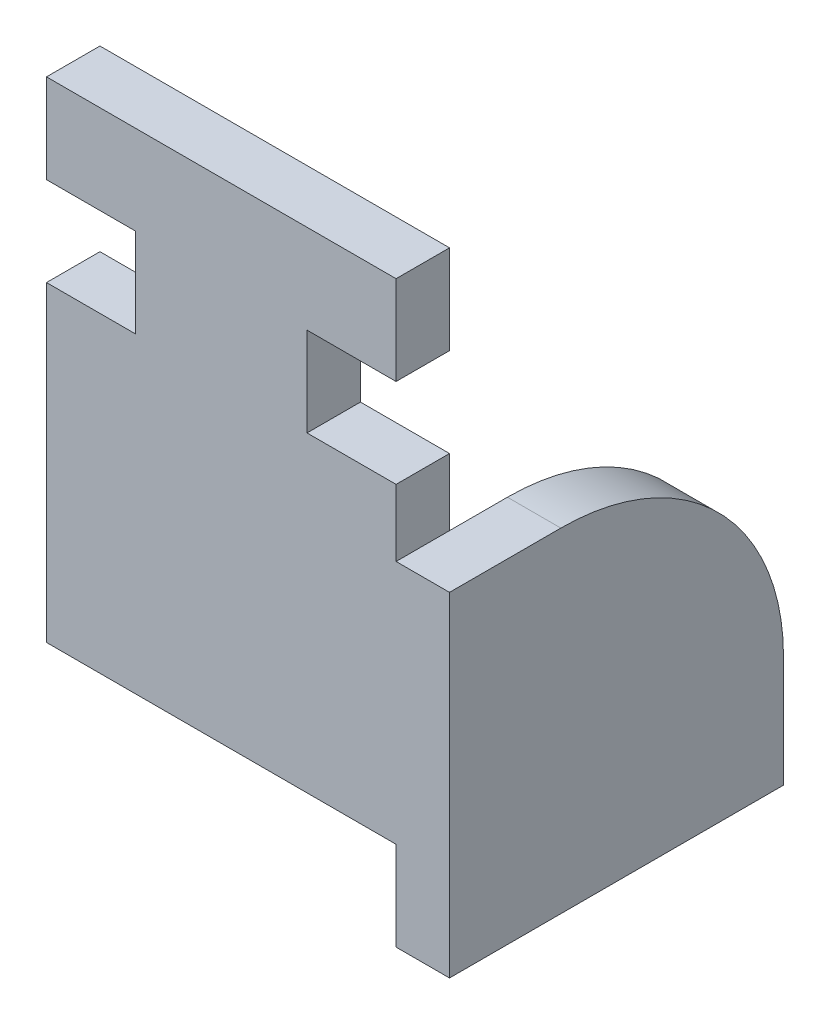
ISO-10303-21;
HEADER;
FILE_DESCRIPTION(('STEP AP214'),'2;1');
FILE_NAME('part.step','',(''),(''),'','','');
FILE_SCHEMA(('AUTOMOTIVE_DESIGN { 1 0 10303 214 1 1 1 1 }'));
ENDSEC;
DATA;
#1=APPLICATION_CONTEXT('core data for automotive mechanical design processes');
#2=APPLICATION_PROTOCOL_DEFINITION('international standard','automotive_design',2000,#1);
#3=PRODUCT_CONTEXT('',#1,'mechanical');
#4=PRODUCT('Part','Part','',(#3));
#5=PRODUCT_RELATED_PRODUCT_CATEGORY('part','',(#4));
#6=PRODUCT_DEFINITION_FORMATION('','',#4);
#7=PRODUCT_DEFINITION_CONTEXT('part definition',#1,'design');
#8=PRODUCT_DEFINITION('design','',#6,#7);
#9=PRODUCT_DEFINITION_SHAPE('','',#8);
#10=(LENGTH_UNIT() NAMED_UNIT(*) SI_UNIT(.MILLI.,.METRE.));
#11=(NAMED_UNIT(*) PLANE_ANGLE_UNIT() SI_UNIT($,.RADIAN.));
#12=(NAMED_UNIT(*) SI_UNIT($,.STERADIAN.) SOLID_ANGLE_UNIT());
#13=UNCERTAINTY_MEASURE_WITH_UNIT(LENGTH_MEASURE(1.E-05),#10,'distance_accuracy_value','');
#14=(GEOMETRIC_REPRESENTATION_CONTEXT(3) GLOBAL_UNCERTAINTY_ASSIGNED_CONTEXT((#13)) GLOBAL_UNIT_ASSIGNED_CONTEXT((#10,
#11,#12)) REPRESENTATION_CONTEXT('',''));
#15=CARTESIAN_POINT('',(0.,0.,0.));
#16=DIRECTION('',(0.,0.,1.));
#17=DIRECTION('',(1.,0.,0.));
#18=AXIS2_PLACEMENT_3D('',#15,#16,#17);
#19=CARTESIAN_POINT('',(1.57,0.,0.24));
#20=DIRECTION('',(0.,1.,0.));
#21=DIRECTION('',(-1.,0.,0.));
#22=AXIS2_PLACEMENT_3D('',#19,#20,#21);
#23=PLANE('',#22);
#24=DIRECTION('',(1.,0.,0.));
#25=VECTOR('',#24,1.);
#26=CARTESIAN_POINT('',(1.57,0.,0.));
#27=LINE('',#26,#25);
#28=CARTESIAN_POINT('',(0.,0.,0.));
#29=VERTEX_POINT('',#28);
#30=CARTESIAN_POINT('',(1.57,0.,0.));
#31=VERTEX_POINT('',#30);
#32=EDGE_CURVE('E249',#29,#31,#27,.T.);
#33=ORIENTED_EDGE('',*,*,#32,.T.);
#34=DIRECTION('',(0.,0.,-1.));
#35=VECTOR('',#34,1.);
#36=CARTESIAN_POINT('',(1.57,0.,0.24));
#37=LINE('',#36,#35);
#38=CARTESIAN_POINT('',(1.57,0.,0.24));
#39=VERTEX_POINT('',#38);
#40=EDGE_CURVE('E371',#39,#31,#37,.T.);
#41=ORIENTED_EDGE('',*,*,#40,.F.);
#42=DIRECTION('',(1.,0.,0.));
#43=VECTOR('',#42,1.);
#44=CARTESIAN_POINT('',(1.57,0.,0.24));
#45=LINE('',#44,#43);
#46=CARTESIAN_POINT('',(0.,0.,0.24));
#47=VERTEX_POINT('',#46);
#48=EDGE_CURVE('E253',#47,#39,#45,.T.);
#49=ORIENTED_EDGE('',*,*,#48,.F.);
#50=DIRECTION('',(0.,0.,-1.));
#51=VECTOR('',#50,1.);
#52=CARTESIAN_POINT('',(0.,0.,0.24));
#53=LINE('',#52,#51);
#54=EDGE_CURVE('E290',#47,#29,#53,.T.);
#55=ORIENTED_EDGE('',*,*,#54,.T.);
#56=EDGE_LOOP('',(#33,#41,#49,#55));
#57=FACE_BOUND('',#56,.T.);
#58=ADVANCED_FACE('F41',(#57),#23,.F.);
#59=CARTESIAN_POINT('',(1.57,1.4,0.24));
#60=DIRECTION('',(-1.,0.,0.));
#61=DIRECTION('',(0.,0.,1.));
#62=AXIS2_PLACEMENT_3D('',#59,#60,#61);
#63=PLANE('',#62);
#64=DIRECTION('',(0.,1.,0.));
#65=VECTOR('',#64,1.);
#66=CARTESIAN_POINT('',(1.57,1.4,0.24));
#67=LINE('',#66,#65);
#68=CARTESIAN_POINT('',(1.57,1.1,0.24));
#69=VERTEX_POINT('',#68);
#70=CARTESIAN_POINT('',(1.57,1.4,0.24));
#71=VERTEX_POINT('',#70);
#72=EDGE_CURVE('E256',#69,#71,#67,.T.);
#73=ORIENTED_EDGE('',*,*,#72,.F.);
#74=DIRECTION('',(0.,0.,-1.));
#75=VECTOR('',#74,1.);
#76=CARTESIAN_POINT('',(1.57,1.1,0.24));
#77=LINE('',#76,#75);
#78=CARTESIAN_POINT('',(1.57,1.1,0.));
#79=VERTEX_POINT('',#78);
#80=EDGE_CURVE('E208',#69,#79,#77,.T.);
#81=ORIENTED_EDGE('',*,*,#80,.T.);
#82=DIRECTION('',(0.,1.,0.));
#83=VECTOR('',#82,1.);
#84=CARTESIAN_POINT('',(1.57,1.4,0.));
#85=LINE('',#84,#83);
#86=CARTESIAN_POINT('',(1.57,1.4,0.));
#87=VERTEX_POINT('',#86);
#88=EDGE_CURVE('E294',#79,#87,#85,.T.);
#89=ORIENTED_EDGE('',*,*,#88,.T.);
#90=DIRECTION('',(0.,0.,-1.));
#91=VECTOR('',#90,1.);
#92=CARTESIAN_POINT('',(1.57,1.4,0.24));
#93=LINE('',#92,#91);
#94=EDGE_CURVE('E367',#71,#87,#93,.T.);
#95=ORIENTED_EDGE('',*,*,#94,.F.);
#96=EDGE_LOOP('',(#73,#81,#89,#95));
#97=FACE_BOUND('',#96,.T.);
#98=ADVANCED_FACE('F390',(#97),#63,.F.);
#99=CARTESIAN_POINT('',(1.17,1.4,0.24));
#100=DIRECTION('',(0.,-1.,0.));
#101=DIRECTION('',(1.,0.,0.));
#102=AXIS2_PLACEMENT_3D('',#99,#100,#101);
#103=PLANE('',#102);
#104=DIRECTION('',(-1.,0.,0.));
#105=VECTOR('',#104,1.);
#106=CARTESIAN_POINT('',(1.17,1.4,0.));
#107=LINE('',#106,#105);
#108=CARTESIAN_POINT('',(1.17,1.4,0.));
#109=VERTEX_POINT('',#108);
#110=EDGE_CURVE('E299',#87,#109,#107,.T.);
#111=ORIENTED_EDGE('',*,*,#110,.T.);
#112=DIRECTION('',(0.,0.,-1.));
#113=VECTOR('',#112,1.);
#114=CARTESIAN_POINT('',(1.17,1.4,0.24));
#115=LINE('',#114,#113);
#116=CARTESIAN_POINT('',(1.17,1.4,0.24));
#117=VERTEX_POINT('',#116);
#118=EDGE_CURVE('E363',#117,#109,#115,.T.);
#119=ORIENTED_EDGE('',*,*,#118,.F.);
#120=DIRECTION('',(-1.,0.,0.));
#121=VECTOR('',#120,1.);
#122=CARTESIAN_POINT('',(1.17,1.4,0.24));
#123=LINE('',#122,#121);
#124=EDGE_CURVE('E260',#71,#117,#123,.T.);
#125=ORIENTED_EDGE('',*,*,#124,.F.);
#126=ORIENTED_EDGE('',*,*,#94,.T.);
#127=EDGE_LOOP('',(#111,#119,#125,#126));
#128=FACE_BOUND('',#127,.T.);
#129=ADVANCED_FACE('F395',(#128),#103,.F.);
#130=CARTESIAN_POINT('',(1.17,1.8,0.24));
#131=DIRECTION('',(-1.,0.,0.));
#132=DIRECTION('',(0.,0.,1.));
#133=AXIS2_PLACEMENT_3D('',#130,#131,#132);
#134=PLANE('',#133);
#135=DIRECTION('',(0.,1.,0.));
#136=VECTOR('',#135,1.);
#137=CARTESIAN_POINT('',(1.17,1.8,0.));
#138=LINE('',#137,#136);
#139=CARTESIAN_POINT('',(1.17,1.8,0.));
#140=VERTEX_POINT('',#139);
#141=EDGE_CURVE('E302',#109,#140,#138,.T.);
#142=ORIENTED_EDGE('',*,*,#141,.T.);
#143=DIRECTION('',(0.,0.,-1.));
#144=VECTOR('',#143,1.);
#145=CARTESIAN_POINT('',(1.17,1.8,0.24));
#146=LINE('',#145,#144);
#147=CARTESIAN_POINT('',(1.17,1.8,0.24));
#148=VERTEX_POINT('',#147);
#149=EDGE_CURVE('E359',#148,#140,#146,.T.);
#150=ORIENTED_EDGE('',*,*,#149,.F.);
#151=DIRECTION('',(0.,1.,0.));
#152=VECTOR('',#151,1.);
#153=CARTESIAN_POINT('',(1.17,1.8,0.24));
#154=LINE('',#153,#152);
#155=EDGE_CURVE('E263',#117,#148,#154,.T.);
#156=ORIENTED_EDGE('',*,*,#155,.F.);
#157=ORIENTED_EDGE('',*,*,#118,.T.);
#158=EDGE_LOOP('',(#142,#150,#156,#157));
#159=FACE_BOUND('',#158,.T.);
#160=ADVANCED_FACE('F401',(#159),#134,.F.);
#161=CARTESIAN_POINT('',(1.57,1.8,0.24));
#162=DIRECTION('',(0.,1.,0.));
#163=DIRECTION('',(0.,0.,1.));
#164=AXIS2_PLACEMENT_3D('',#161,#162,#163);
#165=PLANE('',#164);
#166=DIRECTION('',(1.,0.,0.));
#167=VECTOR('',#166,1.);
#168=CARTESIAN_POINT('',(1.57,1.8,0.));
#169=LINE('',#168,#167);
#170=CARTESIAN_POINT('',(1.57,1.8,0.));
#171=VERTEX_POINT('',#170);
#172=EDGE_CURVE('E305',#140,#171,#169,.T.);
#173=ORIENTED_EDGE('',*,*,#172,.T.);
#174=DIRECTION('',(0.,0.,-1.));
#175=VECTOR('',#174,1.);
#176=CARTESIAN_POINT('',(1.57,1.8,0.24));
#177=LINE('',#176,#175);
#178=CARTESIAN_POINT('',(1.57,1.8,0.24));
#179=VERTEX_POINT('',#178);
#180=EDGE_CURVE('E355',#179,#171,#177,.T.);
#181=ORIENTED_EDGE('',*,*,#180,.F.);
#182=DIRECTION('',(1.,0.,0.));
#183=VECTOR('',#182,1.);
#184=CARTESIAN_POINT('',(1.57,1.8,0.24));
#185=LINE('',#184,#183);
#186=EDGE_CURVE('E266',#148,#179,#185,.T.);
#187=ORIENTED_EDGE('',*,*,#186,.F.);
#188=ORIENTED_EDGE('',*,*,#149,.T.);
#189=EDGE_LOOP('',(#173,#181,#187,#188));
#190=FACE_BOUND('',#189,.T.);
#191=ADVANCED_FACE('F405',(#190),#165,.F.);
#192=CARTESIAN_POINT('',(1.57,2.2,0.24));
#193=DIRECTION('',(-1.,0.,0.));
#194=DIRECTION('',(0.,0.,1.));
#195=AXIS2_PLACEMENT_3D('',#192,#193,#194);
#196=PLANE('',#195);
#197=DIRECTION('',(0.,1.,0.));
#198=VECTOR('',#197,1.);
#199=CARTESIAN_POINT('',(1.57,2.2,0.));
#200=LINE('',#199,#198);
#201=CARTESIAN_POINT('',(1.57,2.2,0.));
#202=VERTEX_POINT('',#201);
#203=EDGE_CURVE('E308',#171,#202,#200,.T.);
#204=ORIENTED_EDGE('',*,*,#203,.T.);
#205=DIRECTION('',(0.,0.,-1.));
#206=VECTOR('',#205,1.);
#207=CARTESIAN_POINT('',(1.57,2.2,0.24));
#208=LINE('',#207,#206);
#209=CARTESIAN_POINT('',(1.57,2.2,0.24));
#210=VERTEX_POINT('',#209);
#211=EDGE_CURVE('E351',#210,#202,#208,.T.);
#212=ORIENTED_EDGE('',*,*,#211,.F.);
#213=DIRECTION('',(0.,1.,0.));
#214=VECTOR('',#213,1.);
#215=CARTESIAN_POINT('',(1.57,2.2,0.24));
#216=LINE('',#215,#214);
#217=EDGE_CURVE('E269',#179,#210,#216,.T.);
#218=ORIENTED_EDGE('',*,*,#217,.F.);
#219=ORIENTED_EDGE('',*,*,#180,.T.);
#220=EDGE_LOOP('',(#204,#212,#218,#219));
#221=FACE_BOUND('',#220,.T.);
#222=ADVANCED_FACE('F409',(#221),#196,.F.);
#223=CARTESIAN_POINT('',(0.,2.2,0.24));
#224=DIRECTION('',(0.,-1.,0.));
#225=DIRECTION('',(0.,0.,-1.));
#226=AXIS2_PLACEMENT_3D('',#223,#224,#225);
#227=PLANE('',#226);
#228=DIRECTION('',(-1.,0.,0.));
#229=VECTOR('',#228,1.);
#230=CARTESIAN_POINT('',(0.,2.2,0.));
#231=LINE('',#230,#229);
#232=CARTESIAN_POINT('',(0.,2.2,0.));
#233=VERTEX_POINT('',#232);
#234=EDGE_CURVE('E311',#202,#233,#231,.T.);
#235=ORIENTED_EDGE('',*,*,#234,.T.);
#236=DIRECTION('',(0.,0.,-1.));
#237=VECTOR('',#236,1.);
#238=CARTESIAN_POINT('',(0.,2.2,0.24));
#239=LINE('',#238,#237);
#240=CARTESIAN_POINT('',(0.,2.2,0.24));
#241=VERTEX_POINT('',#240);
#242=EDGE_CURVE('E347',#241,#233,#239,.T.);
#243=ORIENTED_EDGE('',*,*,#242,.F.);
#244=DIRECTION('',(-1.,0.,0.));
#245=VECTOR('',#244,1.);
#246=CARTESIAN_POINT('',(0.,2.2,0.24));
#247=LINE('',#246,#245);
#248=EDGE_CURVE('E272',#210,#241,#247,.T.);
#249=ORIENTED_EDGE('',*,*,#248,.F.);
#250=ORIENTED_EDGE('',*,*,#211,.T.);
#251=EDGE_LOOP('',(#235,#243,#249,#250));
#252=FACE_BOUND('',#251,.T.);
#253=ADVANCED_FACE('F413',(#252),#227,.F.);
#254=CARTESIAN_POINT('',(0.,1.8,0.24));
#255=DIRECTION('',(1.,0.,0.));
#256=DIRECTION('',(0.,0.,-1.));
#257=AXIS2_PLACEMENT_3D('',#254,#255,#256);
#258=PLANE('',#257);
#259=DIRECTION('',(0.,-1.,0.));
#260=VECTOR('',#259,1.);
#261=CARTESIAN_POINT('',(0.,1.8,0.));
#262=LINE('',#261,#260);
#263=CARTESIAN_POINT('',(0.,1.8,0.));
#264=VERTEX_POINT('',#263);
#265=EDGE_CURVE('E314',#233,#264,#262,.T.);
#266=ORIENTED_EDGE('',*,*,#265,.T.);
#267=DIRECTION('',(0.,0.,-1.));
#268=VECTOR('',#267,1.);
#269=CARTESIAN_POINT('',(0.,1.8,0.24));
#270=LINE('',#269,#268);
#271=CARTESIAN_POINT('',(0.,1.8,0.24));
#272=VERTEX_POINT('',#271);
#273=EDGE_CURVE('E343',#272,#264,#270,.T.);
#274=ORIENTED_EDGE('',*,*,#273,.F.);
#275=DIRECTION('',(0.,-1.,0.));
#276=VECTOR('',#275,1.);
#277=CARTESIAN_POINT('',(0.,1.8,0.24));
#278=LINE('',#277,#276);
#279=EDGE_CURVE('E275',#241,#272,#278,.T.);
#280=ORIENTED_EDGE('',*,*,#279,.F.);
#281=ORIENTED_EDGE('',*,*,#242,.T.);
#282=EDGE_LOOP('',(#266,#274,#280,#281));
#283=FACE_BOUND('',#282,.T.);
#284=ADVANCED_FACE('F417',(#283),#258,.F.);
#285=CARTESIAN_POINT('',(0.4,1.8,0.24));
#286=DIRECTION('',(0.,1.,0.));
#287=DIRECTION('',(0.,0.,1.));
#288=AXIS2_PLACEMENT_3D('',#285,#286,#287);
#289=PLANE('',#288);
#290=DIRECTION('',(1.,0.,0.));
#291=VECTOR('',#290,1.);
#292=CARTESIAN_POINT('',(0.4,1.8,0.));
#293=LINE('',#292,#291);
#294=CARTESIAN_POINT('',(0.4,1.8,0.));
#295=VERTEX_POINT('',#294);
#296=EDGE_CURVE('E317',#264,#295,#293,.T.);
#297=ORIENTED_EDGE('',*,*,#296,.T.);
#298=DIRECTION('',(0.,0.,-1.));
#299=VECTOR('',#298,1.);
#300=CARTESIAN_POINT('',(0.4,1.8,0.24));
#301=LINE('',#300,#299);
#302=CARTESIAN_POINT('',(0.4,1.8,0.24));
#303=VERTEX_POINT('',#302);
#304=EDGE_CURVE('E339',#303,#295,#301,.T.);
#305=ORIENTED_EDGE('',*,*,#304,.F.);
#306=DIRECTION('',(1.,0.,0.));
#307=VECTOR('',#306,1.);
#308=CARTESIAN_POINT('',(0.4,1.8,0.24));
#309=LINE('',#308,#307);
#310=EDGE_CURVE('E278',#272,#303,#309,.T.);
#311=ORIENTED_EDGE('',*,*,#310,.F.);
#312=ORIENTED_EDGE('',*,*,#273,.T.);
#313=EDGE_LOOP('',(#297,#305,#311,#312));
#314=FACE_BOUND('',#313,.T.);
#315=ADVANCED_FACE('F421',(#314),#289,.F.);
#316=CARTESIAN_POINT('',(0.4,1.4,0.24));
#317=DIRECTION('',(1.,0.,0.));
#318=DIRECTION('',(0.,1.,0.));
#319=AXIS2_PLACEMENT_3D('',#316,#317,#318);
#320=PLANE('',#319);
#321=DIRECTION('',(0.,-1.,0.));
#322=VECTOR('',#321,1.);
#323=CARTESIAN_POINT('',(0.4,1.4,0.));
#324=LINE('',#323,#322);
#325=CARTESIAN_POINT('',(0.4,1.4,0.));
#326=VERTEX_POINT('',#325);
#327=EDGE_CURVE('E320',#295,#326,#324,.T.);
#328=ORIENTED_EDGE('',*,*,#327,.T.);
#329=DIRECTION('',(0.,0.,-1.));
#330=VECTOR('',#329,1.);
#331=CARTESIAN_POINT('',(0.4,1.4,0.24));
#332=LINE('',#331,#330);
#333=CARTESIAN_POINT('',(0.4,1.4,0.24));
#334=VERTEX_POINT('',#333);
#335=EDGE_CURVE('E335',#334,#326,#332,.T.);
#336=ORIENTED_EDGE('',*,*,#335,.F.);
#337=DIRECTION('',(0.,-1.,0.));
#338=VECTOR('',#337,1.);
#339=CARTESIAN_POINT('',(0.4,1.4,0.24));
#340=LINE('',#339,#338);
#341=EDGE_CURVE('E281',#303,#334,#340,.T.);
#342=ORIENTED_EDGE('',*,*,#341,.F.);
#343=ORIENTED_EDGE('',*,*,#304,.T.);
#344=EDGE_LOOP('',(#328,#336,#342,#343));
#345=FACE_BOUND('',#344,.T.);
#346=ADVANCED_FACE('F425',(#345),#320,.F.);
#347=CARTESIAN_POINT('',(0.,1.4,0.24));
#348=DIRECTION('',(0.,-1.,0.));
#349=DIRECTION('',(0.,0.,-1.));
#350=AXIS2_PLACEMENT_3D('',#347,#348,#349);
#351=PLANE('',#350);
#352=DIRECTION('',(-1.,0.,0.));
#353=VECTOR('',#352,1.);
#354=CARTESIAN_POINT('',(0.,1.4,0.));
#355=LINE('',#354,#353);
#356=CARTESIAN_POINT('',(0.,1.4,0.));
#357=VERTEX_POINT('',#356);
#358=EDGE_CURVE('E323',#326,#357,#355,.T.);
#359=ORIENTED_EDGE('',*,*,#358,.T.);
#360=DIRECTION('',(0.,0.,-1.));
#361=VECTOR('',#360,1.);
#362=CARTESIAN_POINT('',(0.,1.4,0.24));
#363=LINE('',#362,#361);
#364=CARTESIAN_POINT('',(0.,1.4,0.24));
#365=VERTEX_POINT('',#364);
#366=EDGE_CURVE('E331',#365,#357,#363,.T.);
#367=ORIENTED_EDGE('',*,*,#366,.F.);
#368=DIRECTION('',(-1.,0.,0.));
#369=VECTOR('',#368,1.);
#370=CARTESIAN_POINT('',(0.,1.4,0.24));
#371=LINE('',#370,#369);
#372=EDGE_CURVE('E284',#334,#365,#371,.T.);
#373=ORIENTED_EDGE('',*,*,#372,.F.);
#374=ORIENTED_EDGE('',*,*,#335,.T.);
#375=EDGE_LOOP('',(#359,#367,#373,#374));
#376=FACE_BOUND('',#375,.T.);
#377=ADVANCED_FACE('F429',(#376),#351,.F.);
#378=CARTESIAN_POINT('',(0.,0.,0.24));
#379=DIRECTION('',(1.,0.,0.));
#380=DIRECTION('',(0.,0.,-1.));
#381=AXIS2_PLACEMENT_3D('',#378,#379,#380);
#382=PLANE('',#381);
#383=DIRECTION('',(0.,-1.,0.));
#384=VECTOR('',#383,1.);
#385=CARTESIAN_POINT('',(0.,0.,0.));
#386=LINE('',#385,#384);
#387=EDGE_CURVE('E257',#357,#29,#386,.T.);
#388=ORIENTED_EDGE('',*,*,#387,.T.);
#389=ORIENTED_EDGE('',*,*,#54,.F.);
#390=DIRECTION('',(0.,-1.,0.));
#391=VECTOR('',#390,1.);
#392=CARTESIAN_POINT('',(0.,0.,0.24));
#393=LINE('',#392,#391);
#394=EDGE_CURVE('E287',#365,#47,#393,.T.);
#395=ORIENTED_EDGE('',*,*,#394,.F.);
#396=ORIENTED_EDGE('',*,*,#366,.T.);
#397=EDGE_LOOP('',(#388,#389,#395,#396));
#398=FACE_BOUND('',#397,.T.);
#399=ADVANCED_FACE('F433',(#398),#382,.F.);
#400=CARTESIAN_POINT('',(0.,0.,0.24));
#401=DIRECTION('',(0.,0.,-1.));
#402=DIRECTION('',(-1.,0.,0.));
#403=AXIS2_PLACEMENT_3D('',#400,#401,#402);
#404=PLANE('',#403);
#405=ORIENTED_EDGE('',*,*,#48,.T.);
#406=DIRECTION('',(0.,1.,0.));
#407=VECTOR('',#406,1.);
#408=CARTESIAN_POINT('',(1.57,-0.4,0.24));
#409=LINE('',#408,#407);
#410=CARTESIAN_POINT('',(1.57,-0.4,0.24));
#411=VERTEX_POINT('',#410);
#412=EDGE_CURVE('E239',#411,#39,#409,.T.);
#413=ORIENTED_EDGE('',*,*,#412,.F.);
#414=DIRECTION('',(-1.,0.,0.));
#415=VECTOR('',#414,1.);
#416=CARTESIAN_POINT('',(1.81,-0.4,0.24));
#417=LINE('',#416,#415);
#418=CARTESIAN_POINT('',(1.81,-0.4,0.24));
#419=VERTEX_POINT('',#418);
#420=EDGE_CURVE('E225',#419,#411,#417,.T.);
#421=ORIENTED_EDGE('',*,*,#420,.F.);
#422=DIRECTION('',(0.,1.,0.));
#423=VECTOR('',#422,1.);
#424=CARTESIAN_POINT('',(1.81,-0.4,0.24));
#425=LINE('',#424,#423);
#426=CARTESIAN_POINT('',(1.81,1.1,0.24));
#427=VERTEX_POINT('',#426);
#428=EDGE_CURVE('E218',#419,#427,#425,.T.);
#429=ORIENTED_EDGE('',*,*,#428,.T.);
#430=DIRECTION('',(-1.,0.,0.));
#431=VECTOR('',#430,1.);
#432=CARTESIAN_POINT('',(1.81,1.1,0.24));
#433=LINE('',#432,#431);
#434=EDGE_CURVE('E200',#427,#69,#433,.T.);
#435=ORIENTED_EDGE('',*,*,#434,.T.);
#436=ORIENTED_EDGE('',*,*,#72,.T.);
#437=ORIENTED_EDGE('',*,*,#124,.T.);
#438=ORIENTED_EDGE('',*,*,#155,.T.);
#439=ORIENTED_EDGE('',*,*,#186,.T.);
#440=ORIENTED_EDGE('',*,*,#217,.T.);
#441=ORIENTED_EDGE('',*,*,#248,.T.);
#442=ORIENTED_EDGE('',*,*,#279,.T.);
#443=ORIENTED_EDGE('',*,*,#310,.T.);
#444=ORIENTED_EDGE('',*,*,#341,.T.);
#445=ORIENTED_EDGE('',*,*,#372,.T.);
#446=ORIENTED_EDGE('',*,*,#394,.T.);
#447=EDGE_LOOP('',(#405,#413,#421,#429,#435,#436,#437,#438,#439,#440,#441,#442,#443,#444,#445,#446));
#448=FACE_BOUND('',#447,.T.);
#449=ADVANCED_FACE('F223',(#448),#404,.F.);
#450=CARTESIAN_POINT('',(0.,0.,0.));
#451=DIRECTION('',(0.,0.,-1.));
#452=DIRECTION('',(-1.,0.,0.));
#453=AXIS2_PLACEMENT_3D('',#450,#451,#452);
#454=PLANE('',#453);
#455=ORIENTED_EDGE('',*,*,#32,.F.);
#456=ORIENTED_EDGE('',*,*,#387,.F.);
#457=ORIENTED_EDGE('',*,*,#358,.F.);
#458=ORIENTED_EDGE('',*,*,#327,.F.);
#459=ORIENTED_EDGE('',*,*,#296,.F.);
#460=ORIENTED_EDGE('',*,*,#265,.F.);
#461=ORIENTED_EDGE('',*,*,#234,.F.);
#462=ORIENTED_EDGE('',*,*,#203,.F.);
#463=ORIENTED_EDGE('',*,*,#172,.F.);
#464=ORIENTED_EDGE('',*,*,#141,.F.);
#465=ORIENTED_EDGE('',*,*,#110,.F.);
#466=ORIENTED_EDGE('',*,*,#88,.F.);
#467=EDGE_CURVE('E295',#31,#79,#85,.T.);
#468=ORIENTED_EDGE('',*,*,#467,.F.);
#469=EDGE_LOOP('',(#455,#456,#457,#458,#459,#460,#461,#462,#463,#464,#465,#466,#468));
#470=FACE_BOUND('',#469,.T.);
#471=ADVANCED_FACE('F438',(#470),#454,.T.);
#472=CARTESIAN_POINT('',(1.57,0.,0.));
#473=DIRECTION('',(-1.,0.,0.));
#474=DIRECTION('',(0.,0.,1.));
#475=AXIS2_PLACEMENT_3D('',#472,#473,#474);
#476=PLANE('',#475);
#477=CARTESIAN_POINT('',(1.57,1.1,-0.26));
#478=VERTEX_POINT('',#477);
#479=EDGE_CURVE('E243',#79,#478,#77,.T.);
#480=ORIENTED_EDGE('',*,*,#479,.T.);
#481=CARTESIAN_POINT('',(1.57,0.1,-0.26));
#482=DIRECTION('',(-1.,0.,0.));
#483=DIRECTION('',(0.,0.,1.));
#484=AXIS2_PLACEMENT_3D('',#481,#482,#483);
#485=CIRCLE('',#484,1.);
#486=CARTESIAN_POINT('',(1.57,0.1,-1.26));
#487=VERTEX_POINT('',#486);
#488=EDGE_CURVE('E69',#478,#487,#485,.T.);
#489=ORIENTED_EDGE('',*,*,#488,.T.);
#490=DIRECTION('',(0.,1.,0.));
#491=VECTOR('',#490,1.);
#492=CARTESIAN_POINT('',(1.57,-0.4,-1.26));
#493=LINE('',#492,#491);
#494=CARTESIAN_POINT('',(1.57,-0.4,-1.26));
#495=VERTEX_POINT('',#494);
#496=EDGE_CURVE('E232',#495,#487,#493,.T.);
#497=ORIENTED_EDGE('',*,*,#496,.F.);
#498=DIRECTION('',(0.,0.,-1.));
#499=VECTOR('',#498,1.);
#500=CARTESIAN_POINT('',(1.57,-0.4,0.24));
#501=LINE('',#500,#499);
#502=EDGE_CURVE('E228',#411,#495,#501,.T.);
#503=ORIENTED_EDGE('',*,*,#502,.F.);
#504=ORIENTED_EDGE('',*,*,#412,.T.);
#505=ORIENTED_EDGE('',*,*,#40,.T.);
#506=ORIENTED_EDGE('',*,*,#467,.T.);
#507=EDGE_LOOP('',(#480,#489,#497,#503,#504,#505,#506));
#508=FACE_BOUND('',#507,.T.);
#509=ADVANCED_FACE('F382',(#508),#476,.T.);
#510=CARTESIAN_POINT('',(1.81,-0.4,0.24));
#511=DIRECTION('',(0.,1.,0.));
#512=DIRECTION('',(0.,0.,1.));
#513=AXIS2_PLACEMENT_3D('',#510,#511,#512);
#514=PLANE('',#513);
#515=ORIENTED_EDGE('',*,*,#502,.T.);
#516=DIRECTION('',(-1.,0.,0.));
#517=VECTOR('',#516,1.);
#518=CARTESIAN_POINT('',(1.81,-0.4,-1.26));
#519=LINE('',#518,#517);
#520=CARTESIAN_POINT('',(1.81,-0.4,-1.26));
#521=VERTEX_POINT('',#520);
#522=EDGE_CURVE('E212',#521,#495,#519,.T.);
#523=ORIENTED_EDGE('',*,*,#522,.F.);
#524=DIRECTION('',(0.,0.,-1.));
#525=VECTOR('',#524,1.);
#526=CARTESIAN_POINT('',(1.81,-0.4,0.24));
#527=LINE('',#526,#525);
#528=EDGE_CURVE('E213',#419,#521,#527,.T.);
#529=ORIENTED_EDGE('',*,*,#528,.F.);
#530=ORIENTED_EDGE('',*,*,#420,.T.);
#531=EDGE_LOOP('',(#515,#523,#529,#530));
#532=FACE_BOUND('',#531,.T.);
#533=ADVANCED_FACE('F449',(#532),#514,.F.);
#534=CARTESIAN_POINT('',(1.81,-0.4,-1.26));
#535=DIRECTION('',(0.,0.,1.));
#536=DIRECTION('',(1.,0.,0.));
#537=AXIS2_PLACEMENT_3D('',#534,#535,#536);
#538=PLANE('',#537);
#539=ORIENTED_EDGE('',*,*,#496,.T.);
#540=DIRECTION('',(-1.,0.,0.));
#541=VECTOR('',#540,1.);
#542=CARTESIAN_POINT('',(1.81,0.1,-1.26));
#543=LINE('',#542,#541);
#544=CARTESIAN_POINT('',(1.81,0.1,-1.26));
#545=VERTEX_POINT('',#544);
#546=EDGE_CURVE('E50',#487,#545,#543,.F.);
#547=ORIENTED_EDGE('',*,*,#546,.T.);
#548=DIRECTION('',(0.,1.,0.));
#549=VECTOR('',#548,1.);
#550=CARTESIAN_POINT('',(1.81,-0.4,-1.26));
#551=LINE('',#550,#549);
#552=EDGE_CURVE('E221',#521,#545,#551,.T.);
#553=ORIENTED_EDGE('',*,*,#552,.F.);
#554=ORIENTED_EDGE('',*,*,#522,.T.);
#555=EDGE_LOOP('',(#539,#547,#553,#554));
#556=FACE_BOUND('',#555,.T.);
#557=ADVANCED_FACE('F446',(#556),#538,.F.);
#558=CARTESIAN_POINT('',(1.81,1.1,0.24));
#559=DIRECTION('',(0.,1.,0.));
#560=DIRECTION('',(0.,0.,1.));
#561=AXIS2_PLACEMENT_3D('',#558,#559,#560);
#562=PLANE('',#561);
#563=DIRECTION('',(0.,0.,-1.));
#564=VECTOR('',#563,1.);
#565=CARTESIAN_POINT('',(1.81,1.1,0.24));
#566=LINE('',#565,#564);
#567=CARTESIAN_POINT('',(1.81,1.1,-0.26));
#568=VERTEX_POINT('',#567);
#569=EDGE_CURVE('E204',#427,#568,#566,.T.);
#570=ORIENTED_EDGE('',*,*,#569,.T.);
#571=DIRECTION('',(-1.,0.,0.));
#572=VECTOR('',#571,1.);
#573=CARTESIAN_POINT('',(1.57,1.1,-0.26));
#574=LINE('',#573,#572);
#575=EDGE_CURVE('E375',#568,#478,#574,.T.);
#576=ORIENTED_EDGE('',*,*,#575,.T.);
#577=ORIENTED_EDGE('',*,*,#479,.F.);
#578=ORIENTED_EDGE('',*,*,#80,.F.);
#579=ORIENTED_EDGE('',*,*,#434,.F.);
#580=EDGE_LOOP('',(#570,#576,#577,#578,#579));
#581=FACE_BOUND('',#580,.T.);
#582=ADVANCED_FACE('F202',(#581),#562,.T.);
#583=CARTESIAN_POINT('',(1.81,0.,0.));
#584=DIRECTION('',(-1.,0.,0.));
#585=DIRECTION('',(0.,0.,1.));
#586=AXIS2_PLACEMENT_3D('',#583,#584,#585);
#587=PLANE('',#586);
#588=ORIENTED_EDGE('',*,*,#552,.T.);
#589=CARTESIAN_POINT('',(1.81,0.1,-0.26));
#590=DIRECTION('',(-1.,0.,0.));
#591=DIRECTION('',(0.,0.,1.));
#592=AXIS2_PLACEMENT_3D('',#589,#590,#591);
#593=CIRCLE('',#592,1.);
#594=EDGE_CURVE('E11',#545,#568,#593,.F.);
#595=ORIENTED_EDGE('',*,*,#594,.T.);
#596=ORIENTED_EDGE('',*,*,#569,.F.);
#597=ORIENTED_EDGE('',*,*,#428,.F.);
#598=ORIENTED_EDGE('',*,*,#528,.T.);
#599=EDGE_LOOP('',(#588,#595,#596,#597,#598));
#600=FACE_BOUND('',#599,.T.);
#601=ADVANCED_FACE('F217',(#600),#587,.F.);
#602=CARTESIAN_POINT('',(1.81,0.1,-0.26));
#603=DIRECTION('',(1.,0.,0.));
#604=DIRECTION('',(0.,0.,-1.));
#605=AXIS2_PLACEMENT_3D('',#602,#603,#604);
#606=CYLINDRICAL_SURFACE('',#605,1.);
#607=ORIENTED_EDGE('',*,*,#594,.F.);
#608=ORIENTED_EDGE('',*,*,#546,.F.);
#609=ORIENTED_EDGE('',*,*,#488,.F.);
#610=ORIENTED_EDGE('',*,*,#575,.F.);
#611=EDGE_LOOP('',(#607,#608,#609,#610));
#612=FACE_BOUND('',#611,.T.);
#613=ADVANCED_FACE('F43',(#612),#606,.T.);
#614=CLOSED_SHELL('',(#58,#98,#129,#160,#191,#222,#253,#284,#315,#346,#377,#399,#449,#471,#509,
#533,#557,#582,#601,#613));
#615=MANIFOLD_SOLID_BREP('B2',#614);
#616=ADVANCED_BREP_SHAPE_REPRESENTATION('',(#18,#615),#14);
#617=SHAPE_DEFINITION_REPRESENTATION(#9,#616);
ENDSEC;
END-ISO-10303-21;
